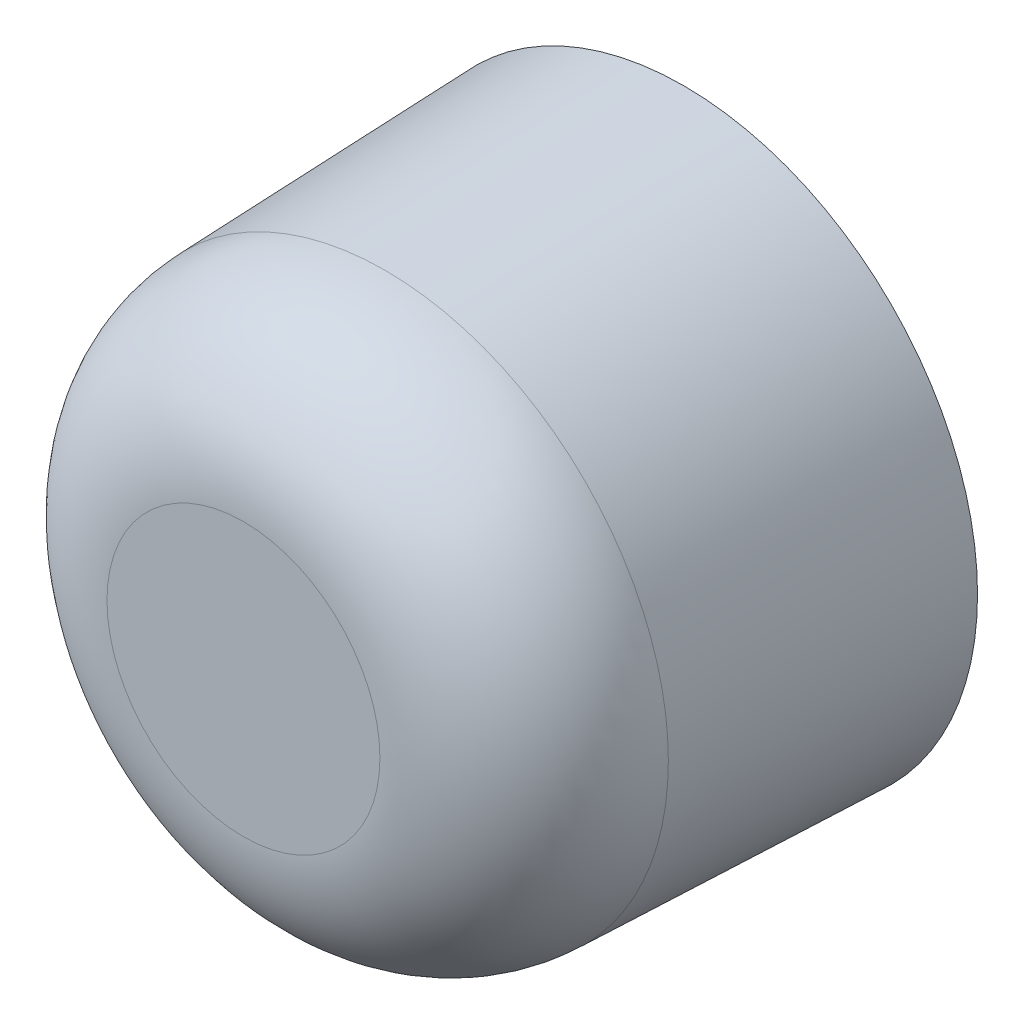
ISO-10303-21;
HEADER;
FILE_DESCRIPTION(('STEP AP214'),'2;1');
FILE_NAME('part.step','',(''),(''),'','','');
FILE_SCHEMA(('AUTOMOTIVE_DESIGN { 1 0 10303 214 1 1 1 1 }'));
ENDSEC;
DATA;
#1=APPLICATION_CONTEXT('core data for automotive mechanical design processes');
#2=APPLICATION_PROTOCOL_DEFINITION('international standard','automotive_design',2000,#1);
#3=PRODUCT_CONTEXT('',#1,'mechanical');
#4=PRODUCT('Part','Part','',(#3));
#5=PRODUCT_RELATED_PRODUCT_CATEGORY('part','',(#4));
#6=PRODUCT_DEFINITION_FORMATION('','',#4);
#7=PRODUCT_DEFINITION_CONTEXT('part definition',#1,'design');
#8=PRODUCT_DEFINITION('design','',#6,#7);
#9=PRODUCT_DEFINITION_SHAPE('','',#8);
#10=(LENGTH_UNIT() NAMED_UNIT(*) SI_UNIT(.MILLI.,.METRE.));
#11=(NAMED_UNIT(*) PLANE_ANGLE_UNIT() SI_UNIT($,.RADIAN.));
#12=(NAMED_UNIT(*) SI_UNIT($,.STERADIAN.) SOLID_ANGLE_UNIT());
#13=UNCERTAINTY_MEASURE_WITH_UNIT(LENGTH_MEASURE(1.E-05),#10,'distance_accuracy_value','');
#14=(GEOMETRIC_REPRESENTATION_CONTEXT(3) GLOBAL_UNCERTAINTY_ASSIGNED_CONTEXT((#13)) GLOBAL_UNIT_ASSIGNED_CONTEXT((#10,
#11,#12)) REPRESENTATION_CONTEXT('',''));
#15=CARTESIAN_POINT('',(0.,0.,0.));
#16=DIRECTION('',(0.,0.,1.));
#17=DIRECTION('',(1.,0.,0.));
#18=AXIS2_PLACEMENT_3D('',#15,#16,#17);
#19=CARTESIAN_POINT('',(0.,0.,0.));
#20=DIRECTION('',(0.,0.,-1.));
#21=DIRECTION('',(1.,0.,0.));
#22=AXIS2_PLACEMENT_3D('',#19,#20,#21);
#23=CONICAL_SURFACE('',#22,10.,0.0349065850398866);
#24=CARTESIAN_POINT('',(0.,0.,10.1744974835125));
#25=DIRECTION('',(0.,0.,-1.));
#26=DIRECTION('',(-1.,0.,0.));
#27=AXIS2_PLACEMENT_3D('',#24,#25,#26);
#28=CIRCLE('',#27,9.64469871868389);
#29=CARTESIAN_POINT('',(-9.64469871868389,0.,10.1744974835125));
#30=VERTEX_POINT('',#29);
#31=EDGE_CURVE('E10',#30,#30,#28,.T.);
#32=ORIENTED_EDGE('',*,*,#31,.T.);
#33=EDGE_LOOP('',(#32));
#34=FACE_BOUND('',#33,.T.);
#35=CARTESIAN_POINT('',(0.,0.,0.));
#36=DIRECTION('',(0.,0.,1.));
#37=DIRECTION('',(1.,0.,0.));
#38=AXIS2_PLACEMENT_3D('',#35,#36,#37);
#39=CIRCLE('',#38,10.);
#40=CARTESIAN_POINT('',(10.,0.,0.));
#41=VERTEX_POINT('',#40);
#42=EDGE_CURVE('E51',#41,#41,#39,.T.);
#43=ORIENTED_EDGE('',*,*,#42,.T.);
#44=EDGE_LOOP('',(#43));
#45=FACE_BOUND('',#44,.T.);
#46=ADVANCED_FACE('F37',(#34,#45),#23,.T.);
#47=CARTESIAN_POINT('',(0.,0.,15.));
#48=DIRECTION('',(0.,0.,1.));
#49=DIRECTION('',(1.,0.,0.));
#50=AXIS2_PLACEMENT_3D('',#47,#48,#49);
#51=PLANE('',#50);
#52=CARTESIAN_POINT('',(0.,0.,15.));
#53=DIRECTION('',(0.,0.,1.));
#54=DIRECTION('',(1.,0.,0.));
#55=AXIS2_PLACEMENT_3D('',#52,#53,#54);
#56=CIRCLE('',#55,4.64774458358841);
#57=CARTESIAN_POINT('',(4.64774458358841,0.,15.));
#58=VERTEX_POINT('',#57);
#59=EDGE_CURVE('E46',#58,#58,#56,.T.);
#60=ORIENTED_EDGE('',*,*,#59,.T.);
#61=EDGE_LOOP('',(#60));
#62=FACE_BOUND('',#61,.T.);
#63=ADVANCED_FACE('F90',(#62),#51,.T.);
#64=CARTESIAN_POINT('',(0.,0.,0.));
#65=DIRECTION('',(0.,0.,1.));
#66=DIRECTION('',(1.,0.,0.));
#67=AXIS2_PLACEMENT_3D('',#64,#65,#66);
#68=PLANE('',#67);
#69=CARTESIAN_POINT('',(0.,0.,0.));
#70=DIRECTION('',(0.,0.,-1.));
#71=DIRECTION('',(-1.,0.,0.));
#72=AXIS2_PLACEMENT_3D('',#69,#70,#71);
#73=CIRCLE('',#72,7.5);
#74=CARTESIAN_POINT('',(-7.5,0.,0.));
#75=VERTEX_POINT('',#74);
#76=EDGE_CURVE('E61',#75,#75,#73,.T.);
#77=ORIENTED_EDGE('',*,*,#76,.F.);
#78=EDGE_LOOP('',(#77));
#79=FACE_BOUND('',#78,.T.);
#80=ORIENTED_EDGE('',*,*,#42,.F.);
#81=EDGE_LOOP('',(#80));
#82=FACE_BOUND('',#81,.T.);
#83=ADVANCED_FACE('F94',(#79,#82),#68,.F.);
#84=CARTESIAN_POINT('',(0.,0.,10.));
#85=DIRECTION('',(0.,0.,1.));
#86=DIRECTION('',(1.,0.,0.));
#87=AXIS2_PLACEMENT_3D('',#84,#85,#86);
#88=DEGENERATE_TOROIDAL_SURFACE('',#87,4.64774458358841,5.,.T.);
#89=ORIENTED_EDGE('',*,*,#31,.F.);
#90=EDGE_LOOP('',(#89));
#91=FACE_BOUND('',#90,.T.);
#92=ORIENTED_EDGE('',*,*,#59,.F.);
#93=EDGE_LOOP('',(#92));
#94=FACE_BOUND('',#93,.T.);
#95=ADVANCED_FACE('F39',(#91,#94),#88,.T.);
#96=CARTESIAN_POINT('',(0.,0.,5.));
#97=DIRECTION('',(0.,0.,-1.));
#98=DIRECTION('',(-1.,0.,0.));
#99=AXIS2_PLACEMENT_3D('',#96,#97,#98);
#100=PLANE('',#99);
#101=CARTESIAN_POINT('',(0.,0.,5.));
#102=DIRECTION('',(0.,0.,-1.));
#103=DIRECTION('',(-1.,0.,0.));
#104=AXIS2_PLACEMENT_3D('',#101,#102,#103);
#105=CIRCLE('',#104,7.5);
#106=CARTESIAN_POINT('',(-7.5,0.,5.));
#107=VERTEX_POINT('',#106);
#108=EDGE_CURVE('E65',#107,#107,#105,.T.);
#109=ORIENTED_EDGE('',*,*,#108,.T.);
#110=EDGE_LOOP('',(#109));
#111=FACE_BOUND('',#110,.T.);
#112=CARTESIAN_POINT('',(0.,0.,5.));
#113=DIRECTION('',(0.,0.,-1.));
#114=DIRECTION('',(-1.,0.,0.));
#115=AXIS2_PLACEMENT_3D('',#112,#113,#114);
#116=CIRCLE('',#115,3.);
#117=CARTESIAN_POINT('',(-3.,0.,5.));
#118=VERTEX_POINT('',#117);
#119=EDGE_CURVE('E41',#118,#118,#116,.F.);
#120=ORIENTED_EDGE('',*,*,#119,.T.);
#121=EDGE_LOOP('',(#120));
#122=FACE_BOUND('',#121,.T.);
#123=ADVANCED_FACE('F74',(#111,#122),#100,.T.);
#124=CARTESIAN_POINT('',(0.,0.,5.));
#125=DIRECTION('',(0.,0.,-1.));
#126=DIRECTION('',(-1.,0.,0.));
#127=AXIS2_PLACEMENT_3D('',#124,#125,#126);
#128=CYLINDRICAL_SURFACE('',#127,7.5);
#129=ORIENTED_EDGE('',*,*,#108,.F.);
#130=EDGE_LOOP('',(#129));
#131=FACE_BOUND('',#130,.T.);
#132=ORIENTED_EDGE('',*,*,#76,.T.);
#133=EDGE_LOOP('',(#132));
#134=FACE_BOUND('',#133,.T.);
#135=ADVANCED_FACE('F84',(#131,#134),#128,.F.);
#136=CARTESIAN_POINT('',(0.,0.,12.));
#137=DIRECTION('',(0.,0.,-1.));
#138=DIRECTION('',(-1.,0.,0.));
#139=AXIS2_PLACEMENT_3D('',#136,#137,#138);
#140=PLANE('',#139);
#141=CARTESIAN_POINT('',(0.,0.,12.));
#142=DIRECTION('',(0.,0.,-1.));
#143=DIRECTION('',(-1.,0.,0.));
#144=AXIS2_PLACEMENT_3D('',#141,#142,#143);
#145=CIRCLE('',#144,3.);
#146=CARTESIAN_POINT('',(-3.,0.,12.));
#147=VERTEX_POINT('',#146);
#148=EDGE_CURVE('E57',#147,#147,#145,.T.);
#149=ORIENTED_EDGE('',*,*,#148,.T.);
#150=EDGE_LOOP('',(#149));
#151=FACE_BOUND('',#150,.T.);
#152=ADVANCED_FACE('F78',(#151),#140,.T.);
#153=CARTESIAN_POINT('',(0.,0.,12.));
#154=DIRECTION('',(0.,0.,-1.));
#155=DIRECTION('',(-1.,0.,0.));
#156=AXIS2_PLACEMENT_3D('',#153,#154,#155);
#157=CYLINDRICAL_SURFACE('',#156,3.);
#158=ORIENTED_EDGE('',*,*,#148,.F.);
#159=EDGE_LOOP('',(#158));
#160=FACE_BOUND('',#159,.T.);
#161=ORIENTED_EDGE('',*,*,#119,.F.);
#162=EDGE_LOOP('',(#161));
#163=FACE_BOUND('',#162,.T.);
#164=ADVANCED_FACE('F76',(#160,#163),#157,.F.);
#165=CLOSED_SHELL('',(#46,#63,#83,#95,#123,#135,#152,#164));
#166=MANIFOLD_SOLID_BREP('B2',#165);
#167=ADVANCED_BREP_SHAPE_REPRESENTATION('',(#18,#166),#14);
#168=SHAPE_DEFINITION_REPRESENTATION(#9,#167);
ENDSEC;
END-ISO-10303-21;
